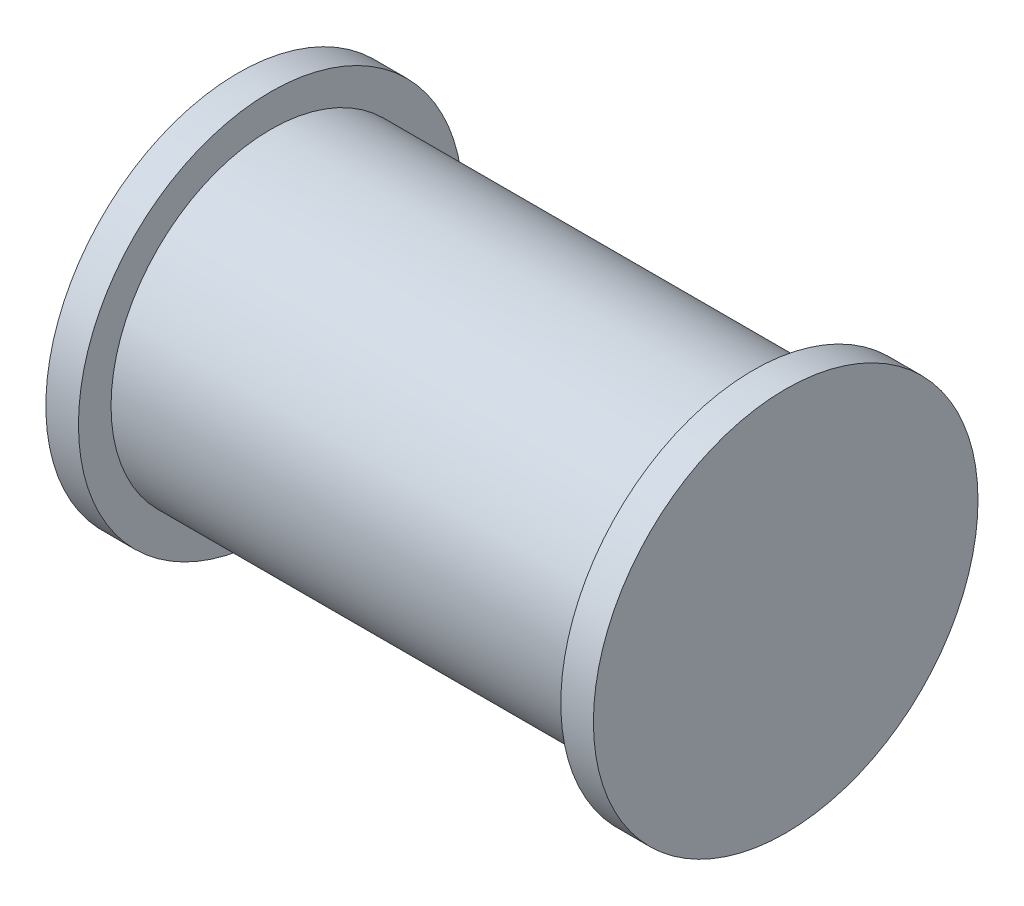
ISO-10303-21;
HEADER;
FILE_DESCRIPTION(('STEP AP214'),'2;1');
FILE_NAME('part.step','',(''),(''),'','','');
FILE_SCHEMA(('AUTOMOTIVE_DESIGN { 1 0 10303 214 1 1 1 1 }'));
ENDSEC;
DATA;
#1=APPLICATION_CONTEXT('core data for automotive mechanical design processes');
#2=APPLICATION_PROTOCOL_DEFINITION('international standard','automotive_design',2000,#1);
#3=PRODUCT_CONTEXT('',#1,'mechanical');
#4=PRODUCT('Part','Part','',(#3));
#5=PRODUCT_RELATED_PRODUCT_CATEGORY('part','',(#4));
#6=PRODUCT_DEFINITION_FORMATION('','',#4);
#7=PRODUCT_DEFINITION_CONTEXT('part definition',#1,'design');
#8=PRODUCT_DEFINITION('design','',#6,#7);
#9=PRODUCT_DEFINITION_SHAPE('','',#8);
#10=(LENGTH_UNIT() NAMED_UNIT(*) SI_UNIT(.MILLI.,.METRE.));
#11=(NAMED_UNIT(*) PLANE_ANGLE_UNIT() SI_UNIT($,.RADIAN.));
#12=(NAMED_UNIT(*) SI_UNIT($,.STERADIAN.) SOLID_ANGLE_UNIT());
#13=UNCERTAINTY_MEASURE_WITH_UNIT(LENGTH_MEASURE(1.E-05),#10,'distance_accuracy_value','');
#14=(GEOMETRIC_REPRESENTATION_CONTEXT(3) GLOBAL_UNCERTAINTY_ASSIGNED_CONTEXT((#13)) GLOBAL_UNIT_ASSIGNED_CONTEXT((#10,
#11,#12)) REPRESENTATION_CONTEXT('',''));
#15=CARTESIAN_POINT('',(0.,0.,0.));
#16=DIRECTION('',(0.,0.,1.));
#17=DIRECTION('',(1.,0.,0.));
#18=AXIS2_PLACEMENT_3D('',#15,#16,#17);
#19=CARTESIAN_POINT('',(-8.4,0.,0.));
#20=DIRECTION('',(1.,0.,0.));
#21=DIRECTION('',(0.,0.,-1.));
#22=AXIS2_PLACEMENT_3D('',#19,#20,#21);
#23=CYLINDRICAL_SURFACE('',#22,4.9);
#24=CARTESIAN_POINT('',(7.4,0.,0.));
#25=DIRECTION('',(-1.,0.,0.));
#26=DIRECTION('',(0.,0.,1.));
#27=AXIS2_PLACEMENT_3D('',#24,#25,#26);
#28=CIRCLE('',#27,4.9);
#29=CARTESIAN_POINT('',(7.4,0.,4.9));
#30=VERTEX_POINT('',#29);
#31=EDGE_CURVE('E10',#30,#30,#28,.F.);
#32=ORIENTED_EDGE('',*,*,#31,.F.);
#33=EDGE_LOOP('',(#32));
#34=FACE_BOUND('',#33,.T.);
#35=CARTESIAN_POINT('',(-7.4,0.,0.));
#36=DIRECTION('',(1.,0.,0.));
#37=DIRECTION('',(0.,0.,-1.));
#38=AXIS2_PLACEMENT_3D('',#35,#36,#37);
#39=CIRCLE('',#38,4.9);
#40=CARTESIAN_POINT('',(-7.4,0.,-4.9));
#41=VERTEX_POINT('',#40);
#42=EDGE_CURVE('E22',#41,#41,#39,.F.);
#43=ORIENTED_EDGE('',*,*,#42,.F.);
#44=EDGE_LOOP('',(#43));
#45=FACE_BOUND('',#44,.T.);
#46=ADVANCED_FACE('F15',(#34,#45),#23,.T.);
#47=CARTESIAN_POINT('',(-7.4,0.,0.));
#48=DIRECTION('',(1.,0.,0.));
#49=DIRECTION('',(0.,0.,-1.));
#50=AXIS2_PLACEMENT_3D('',#47,#48,#49);
#51=PLANE('',#50);
#52=ORIENTED_EDGE('',*,*,#42,.T.);
#53=EDGE_LOOP('',(#52));
#54=FACE_BOUND('',#53,.T.);
#55=CARTESIAN_POINT('',(-7.4,0.,0.));
#56=DIRECTION('',(-1.,0.,0.));
#57=DIRECTION('',(0.,0.,1.));
#58=AXIS2_PLACEMENT_3D('',#55,#56,#57);
#59=CIRCLE('',#58,5.9);
#60=CARTESIAN_POINT('',(-7.4,0.,5.9));
#61=VERTEX_POINT('',#60);
#62=EDGE_CURVE('E30',#61,#61,#59,.T.);
#63=ORIENTED_EDGE('',*,*,#62,.F.);
#64=EDGE_LOOP('',(#63));
#65=FACE_BOUND('',#64,.T.);
#66=ADVANCED_FACE('F65',(#54,#65),#51,.T.);
#67=CARTESIAN_POINT('',(-8.4,0.,0.));
#68=DIRECTION('',(1.,0.,0.));
#69=DIRECTION('',(0.,0.,-1.));
#70=AXIS2_PLACEMENT_3D('',#67,#68,#69);
#71=CYLINDRICAL_SURFACE('',#70,5.9);
#72=ORIENTED_EDGE('',*,*,#62,.T.);
#73=EDGE_LOOP('',(#72));
#74=FACE_BOUND('',#73,.T.);
#75=CARTESIAN_POINT('',(-8.4,0.,0.));
#76=DIRECTION('',(1.,0.,0.));
#77=DIRECTION('',(0.,0.,-1.));
#78=AXIS2_PLACEMENT_3D('',#75,#76,#77);
#79=CIRCLE('',#78,5.9);
#80=CARTESIAN_POINT('',(-8.4,0.,-5.9));
#81=VERTEX_POINT('',#80);
#82=EDGE_CURVE('E36',#81,#81,#79,.T.);
#83=ORIENTED_EDGE('',*,*,#82,.T.);
#84=EDGE_LOOP('',(#83));
#85=FACE_BOUND('',#84,.T.);
#86=ADVANCED_FACE('F61',(#74,#85),#71,.T.);
#87=CARTESIAN_POINT('',(-8.4,0.,0.));
#88=DIRECTION('',(-1.,0.,0.));
#89=DIRECTION('',(0.,0.,1.));
#90=AXIS2_PLACEMENT_3D('',#87,#88,#89);
#91=PLANE('',#90);
#92=ORIENTED_EDGE('',*,*,#82,.F.);
#93=EDGE_LOOP('',(#92));
#94=FACE_BOUND('',#93,.T.);
#95=ADVANCED_FACE('F52',(#94),#91,.T.);
#96=CARTESIAN_POINT('',(7.4,0.,0.));
#97=DIRECTION('',(-1.,0.,0.));
#98=DIRECTION('',(0.,0.,1.));
#99=AXIS2_PLACEMENT_3D('',#96,#97,#98);
#100=PLANE('',#99);
#101=ORIENTED_EDGE('',*,*,#31,.T.);
#102=EDGE_LOOP('',(#101));
#103=FACE_BOUND('',#102,.T.);
#104=CARTESIAN_POINT('',(7.4,0.,0.));
#105=DIRECTION('',(1.,0.,0.));
#106=DIRECTION('',(0.,0.,-1.));
#107=AXIS2_PLACEMENT_3D('',#104,#105,#106);
#108=CIRCLE('',#107,5.9);
#109=CARTESIAN_POINT('',(7.4,0.,-5.9));
#110=VERTEX_POINT('',#109);
#111=EDGE_CURVE('E44',#110,#110,#108,.T.);
#112=ORIENTED_EDGE('',*,*,#111,.F.);
#113=EDGE_LOOP('',(#112));
#114=FACE_BOUND('',#113,.T.);
#115=ADVANCED_FACE('F50',(#103,#114),#100,.T.);
#116=CARTESIAN_POINT('',(7.4,0.,0.));
#117=DIRECTION('',(1.,0.,0.));
#118=DIRECTION('',(0.,0.,-1.));
#119=AXIS2_PLACEMENT_3D('',#116,#117,#118);
#120=CYLINDRICAL_SURFACE('',#119,5.9);
#121=CARTESIAN_POINT('',(8.4,0.,0.));
#122=DIRECTION('',(-1.,0.,0.));
#123=DIRECTION('',(0.,0.,1.));
#124=AXIS2_PLACEMENT_3D('',#121,#122,#123);
#125=CIRCLE('',#124,5.9);
#126=CARTESIAN_POINT('',(8.4,0.,5.9));
#127=VERTEX_POINT('',#126);
#128=EDGE_CURVE('E41',#127,#127,#125,.T.);
#129=ORIENTED_EDGE('',*,*,#128,.T.);
#130=EDGE_LOOP('',(#129));
#131=FACE_BOUND('',#130,.T.);
#132=ORIENTED_EDGE('',*,*,#111,.T.);
#133=EDGE_LOOP('',(#132));
#134=FACE_BOUND('',#133,.T.);
#135=ADVANCED_FACE('F48',(#131,#134),#120,.T.);
#136=CARTESIAN_POINT('',(8.4,0.,0.));
#137=DIRECTION('',(1.,0.,0.));
#138=DIRECTION('',(0.,0.,-1.));
#139=AXIS2_PLACEMENT_3D('',#136,#137,#138);
#140=PLANE('',#139);
#141=ORIENTED_EDGE('',*,*,#128,.F.);
#142=EDGE_LOOP('',(#141));
#143=FACE_BOUND('',#142,.T.);
#144=ADVANCED_FACE('F58',(#143),#140,.T.);
#145=CLOSED_SHELL('',(#46,#66,#86,#95,#115,#135,#144));
#146=MANIFOLD_SOLID_BREP('B1',#145);
#147=ADVANCED_BREP_SHAPE_REPRESENTATION('',(#18,#146),#14);
#148=SHAPE_DEFINITION_REPRESENTATION(#9,#147);
ENDSEC;
END-ISO-10303-21;
